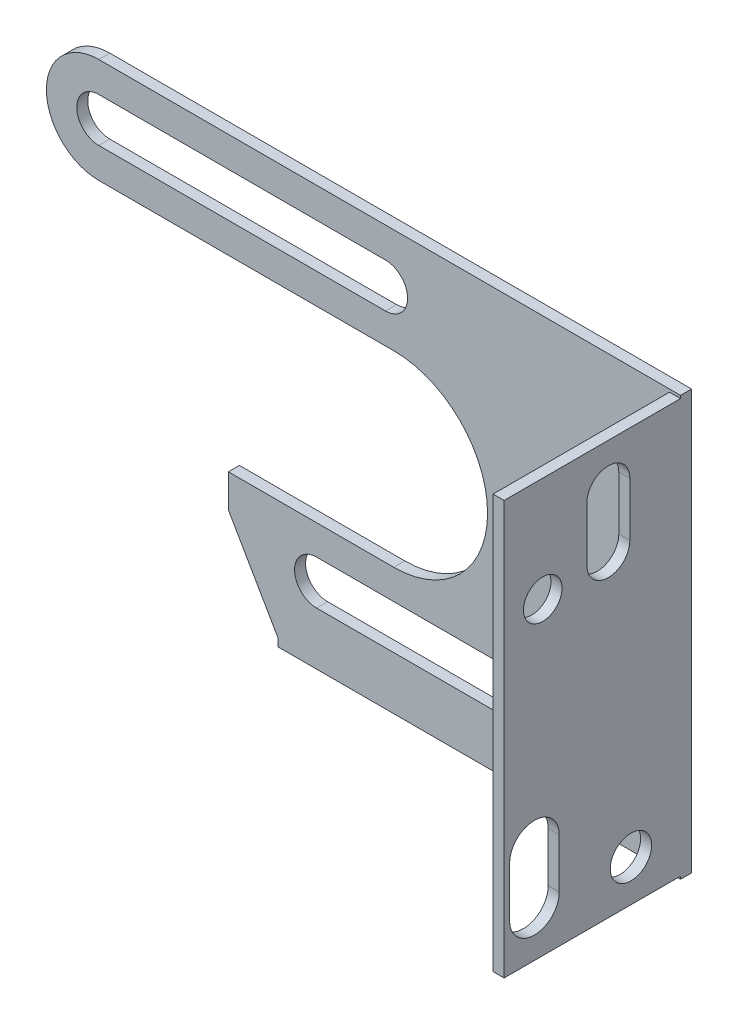
ISO-10303-21;
HEADER;
FILE_DESCRIPTION(('STEP AP214'),'2;1');
FILE_NAME('part.step','',(''),(''),'','','');
FILE_SCHEMA(('AUTOMOTIVE_DESIGN { 1 0 10303 214 1 1 1 1 }'));
ENDSEC;
DATA;
#1=APPLICATION_CONTEXT('core data for automotive mechanical design processes');
#2=APPLICATION_PROTOCOL_DEFINITION('international standard','automotive_design',2000,#1);
#3=PRODUCT_CONTEXT('',#1,'mechanical');
#4=PRODUCT('Part','Part','',(#3));
#5=PRODUCT_RELATED_PRODUCT_CATEGORY('part','',(#4));
#6=PRODUCT_DEFINITION_FORMATION('','',#4);
#7=PRODUCT_DEFINITION_CONTEXT('part definition',#1,'design');
#8=PRODUCT_DEFINITION('design','',#6,#7);
#9=PRODUCT_DEFINITION_SHAPE('','',#8);
#10=(LENGTH_UNIT() NAMED_UNIT(*) SI_UNIT(.MILLI.,.METRE.));
#11=(NAMED_UNIT(*) PLANE_ANGLE_UNIT() SI_UNIT($,.RADIAN.));
#12=(NAMED_UNIT(*) SI_UNIT($,.STERADIAN.) SOLID_ANGLE_UNIT());
#13=UNCERTAINTY_MEASURE_WITH_UNIT(LENGTH_MEASURE(1.E-05),#10,'distance_accuracy_value','');
#14=(GEOMETRIC_REPRESENTATION_CONTEXT(3) GLOBAL_UNCERTAINTY_ASSIGNED_CONTEXT((#13)) GLOBAL_UNIT_ASSIGNED_CONTEXT((#10,
#11,#12)) REPRESENTATION_CONTEXT('',''));
#15=CARTESIAN_POINT('',(0.,0.,0.));
#16=DIRECTION('',(0.,0.,1.));
#17=DIRECTION('',(1.,0.,0.));
#18=AXIS2_PLACEMENT_3D('',#15,#16,#17);
#19=CARTESIAN_POINT('',(0.,-101.6,2.54));
#20=DIRECTION('',(0.,1.,0.));
#21=DIRECTION('',(0.,0.,1.));
#22=AXIS2_PLACEMENT_3D('',#19,#20,#21);
#23=PLANE('',#22);
#24=DIRECTION('',(0.,0.,-1.));
#25=VECTOR('',#24,1.);
#26=CARTESIAN_POINT('',(53.34,-101.6,2.54));
#27=LINE('',#26,#25);
#28=CARTESIAN_POINT('',(53.34,-101.6,2.54));
#29=VERTEX_POINT('',#28);
#30=CARTESIAN_POINT('',(53.34,-101.6,0.));
#31=VERTEX_POINT('',#30);
#32=EDGE_CURVE('E382',#29,#31,#27,.T.);
#33=ORIENTED_EDGE('',*,*,#32,.T.);
#34=DIRECTION('',(1.,0.,0.));
#35=VECTOR('',#34,1.);
#36=CARTESIAN_POINT('',(0.,-101.6,0.));
#37=LINE('',#36,#35);
#38=CARTESIAN_POINT('',(146.05,-101.6,0.));
#39=VERTEX_POINT('',#38);
#40=EDGE_CURVE('E463',#31,#39,#37,.T.);
#41=ORIENTED_EDGE('',*,*,#40,.T.);
#42=DIRECTION('',(0.,0.,-1.));
#43=VECTOR('',#42,1.);
#44=CARTESIAN_POINT('',(146.05,-101.6,2.54));
#45=LINE('',#44,#43);
#46=CARTESIAN_POINT('',(146.05,-101.6,2.54));
#47=VERTEX_POINT('',#46);
#48=EDGE_CURVE('E47',#47,#39,#45,.T.);
#49=ORIENTED_EDGE('',*,*,#48,.F.);
#50=DIRECTION('',(1.,0.,0.));
#51=VECTOR('',#50,1.);
#52=CARTESIAN_POINT('',(0.,-101.6,2.54));
#53=LINE('',#52,#51);
#54=EDGE_CURVE('E464',#29,#47,#53,.T.);
#55=ORIENTED_EDGE('',*,*,#54,.F.);
#56=EDGE_LOOP('',(#33,#41,#49,#55));
#57=FACE_BOUND('',#56,.T.);
#58=ADVANCED_FACE('F40',(#57),#23,.F.);
#59=CARTESIAN_POINT('',(146.05,0.,2.54));
#60=DIRECTION('',(-1.,0.,0.));
#61=DIRECTION('',(0.,0.,1.));
#62=AXIS2_PLACEMENT_3D('',#59,#60,#61);
#63=PLANE('',#62);
#64=DIRECTION('',(0.,0.,-1.));
#65=VECTOR('',#64,1.);
#66=CARTESIAN_POINT('',(146.05,-5.08000000000001,2.54));
#67=LINE('',#66,#65);
#68=CARTESIAN_POINT('',(146.05,-5.08000000000001,2.54));
#69=VERTEX_POINT('',#68);
#70=CARTESIAN_POINT('',(146.05,-5.08000000000001,0.));
#71=VERTEX_POINT('',#70);
#72=EDGE_CURVE('E380',#69,#71,#67,.T.);
#73=ORIENTED_EDGE('',*,*,#72,.F.);
#74=DIRECTION('',(0.,1.,0.));
#75=VECTOR('',#74,1.);
#76=CARTESIAN_POINT('',(146.05,0.,2.54));
#77=LINE('',#76,#75);
#78=CARTESIAN_POINT('',(146.05,-5.715,2.54));
#79=VERTEX_POINT('',#78);
#80=EDGE_CURVE('E466',#79,#69,#77,.T.);
#81=ORIENTED_EDGE('',*,*,#80,.F.);
#82=DIRECTION('',(0.,0.,-1.));
#83=VECTOR('',#82,1.);
#84=CARTESIAN_POINT('',(146.05,-5.715,2.54));
#85=LINE('',#84,#83);
#86=CARTESIAN_POINT('',(146.05,-5.715,43.18));
#87=VERTEX_POINT('',#86);
#88=EDGE_CURVE('E54',#87,#79,#85,.T.);
#89=ORIENTED_EDGE('',*,*,#88,.F.);
#90=DIRECTION('',(0.,1.,0.));
#91=VECTOR('',#90,1.);
#92=CARTESIAN_POINT('',(146.05,-5.715,43.18));
#93=LINE('',#92,#91);
#94=CARTESIAN_POINT('',(146.05,-100.965,43.18));
#95=VERTEX_POINT('',#94);
#96=EDGE_CURVE('E331',#95,#87,#93,.T.);
#97=ORIENTED_EDGE('',*,*,#96,.F.);
#98=DIRECTION('',(0.,0.,1.));
#99=VECTOR('',#98,1.);
#100=CARTESIAN_POINT('',(146.05,-100.965,43.18));
#101=LINE('',#100,#99);
#102=CARTESIAN_POINT('',(146.05,-100.965,2.54));
#103=VERTEX_POINT('',#102);
#104=EDGE_CURVE('E319',#103,#95,#101,.T.);
#105=ORIENTED_EDGE('',*,*,#104,.F.);
#106=EDGE_CURVE('E468',#47,#103,#77,.T.);
#107=ORIENTED_EDGE('',*,*,#106,.F.);
#108=ORIENTED_EDGE('',*,*,#48,.T.);
#109=DIRECTION('',(0.,1.,0.));
#110=VECTOR('',#109,1.);
#111=CARTESIAN_POINT('',(146.05,0.,0.));
#112=LINE('',#111,#110);
#113=EDGE_CURVE('E467',#39,#71,#112,.T.);
#114=ORIENTED_EDGE('',*,*,#113,.T.);
#115=EDGE_LOOP('',(#73,#81,#89,#97,#105,#107,#108,#114));
#116=FACE_BOUND('',#115,.T.);
#117=DIRECTION('',(0.,1.,0.));
#118=VECTOR('',#117,1.);
#119=CARTESIAN_POINT('',(146.05,-78.74,41.91));
#120=LINE('',#119,#118);
#121=CARTESIAN_POINT('',(146.05,-90.1700000000001,41.91));
#122=VERTEX_POINT('',#121);
#123=CARTESIAN_POINT('',(146.05,-78.74,41.91));
#124=VERTEX_POINT('',#123);
#125=EDGE_CURVE('E249',#122,#124,#120,.T.);
#126=ORIENTED_EDGE('',*,*,#125,.T.);
#127=CARTESIAN_POINT('',(146.05,-78.74,36.195));
#128=DIRECTION('',(-1.,0.,0.));
#129=DIRECTION('',(0.,0.,1.));
#130=AXIS2_PLACEMENT_3D('',#127,#128,#129);
#131=CIRCLE('',#130,5.715);
#132=CARTESIAN_POINT('',(146.05,-78.74,30.48));
#133=VERTEX_POINT('',#132);
#134=EDGE_CURVE('E270',#124,#133,#131,.T.);
#135=ORIENTED_EDGE('',*,*,#134,.T.);
#136=DIRECTION('',(0.,-1.,0.));
#137=VECTOR('',#136,1.);
#138=CARTESIAN_POINT('',(146.05,-78.74,30.48));
#139=LINE('',#138,#137);
#140=CARTESIAN_POINT('',(146.05,-90.1700000000001,30.48));
#141=VERTEX_POINT('',#140);
#142=EDGE_CURVE('E255',#133,#141,#139,.T.);
#143=ORIENTED_EDGE('',*,*,#142,.T.);
#144=CARTESIAN_POINT('',(146.05,-90.1700000000001,36.195));
#145=DIRECTION('',(-1.,0.,0.));
#146=DIRECTION('',(0.,0.,1.));
#147=AXIS2_PLACEMENT_3D('',#144,#145,#146);
#148=CIRCLE('',#147,5.715);
#149=EDGE_CURVE('E274',#141,#122,#148,.T.);
#150=ORIENTED_EDGE('',*,*,#149,.T.);
#151=EDGE_LOOP('',(#126,#135,#143,#150));
#152=FACE_BOUND('',#151,.T.);
#153=CARTESIAN_POINT('',(146.05,-29.845,34.29));
#154=DIRECTION('',(-1.,0.,0.));
#155=DIRECTION('',(0.,0.,1.));
#156=AXIS2_PLACEMENT_3D('',#153,#154,#155);
#157=CIRCLE('',#156,4.44499999999999);
#158=CARTESIAN_POINT('',(146.05,-29.845,38.735));
#159=VERTEX_POINT('',#158);
#160=EDGE_CURVE('E256',#159,#159,#157,.T.);
#161=ORIENTED_EDGE('',*,*,#160,.T.);
#162=EDGE_LOOP('',(#161));
#163=FACE_BOUND('',#162,.T.);
#164=DIRECTION('',(0.,1.,0.));
#165=VECTOR('',#164,1.);
#166=CARTESIAN_POINT('',(146.05,-15.748,24.13));
#167=LINE('',#166,#165);
#168=CARTESIAN_POINT('',(146.05,-28.1559,24.13));
#169=VERTEX_POINT('',#168);
#170=CARTESIAN_POINT('',(146.05,-15.748,24.13));
#171=VERTEX_POINT('',#170);
#172=EDGE_CURVE('E292',#169,#171,#167,.T.);
#173=ORIENTED_EDGE('',*,*,#172,.T.);
#174=CARTESIAN_POINT('',(146.05,-15.748,19.177));
#175=DIRECTION('',(-1.,0.,0.));
#176=DIRECTION('',(0.,0.,1.));
#177=AXIS2_PLACEMENT_3D('',#174,#175,#176);
#178=CIRCLE('',#177,4.953);
#179=CARTESIAN_POINT('',(146.05,-15.748,14.224));
#180=VERTEX_POINT('',#179);
#181=EDGE_CURVE('E286',#171,#180,#178,.T.);
#182=ORIENTED_EDGE('',*,*,#181,.T.);
#183=DIRECTION('',(0.,-1.,0.));
#184=VECTOR('',#183,1.);
#185=CARTESIAN_POINT('',(146.05,-15.748,14.224));
#186=LINE('',#185,#184);
#187=CARTESIAN_POINT('',(146.05,-28.1559,14.224));
#188=VERTEX_POINT('',#187);
#189=EDGE_CURVE('E302',#180,#188,#186,.T.);
#190=ORIENTED_EDGE('',*,*,#189,.T.);
#191=CARTESIAN_POINT('',(146.05,-28.1559,19.177));
#192=DIRECTION('',(-1.,0.,0.));
#193=DIRECTION('',(0.,0.,1.));
#194=AXIS2_PLACEMENT_3D('',#191,#192,#193);
#195=CIRCLE('',#194,4.953);
#196=EDGE_CURVE('E305',#188,#169,#195,.T.);
#197=ORIENTED_EDGE('',*,*,#196,.T.);
#198=EDGE_LOOP('',(#173,#182,#190,#197));
#199=FACE_BOUND('',#198,.T.);
#200=CARTESIAN_POINT('',(146.05,-91.44,13.97));
#201=DIRECTION('',(-1.,0.,0.));
#202=DIRECTION('',(0.,0.,1.));
#203=AXIS2_PLACEMENT_3D('',#200,#201,#202);
#204=CIRCLE('',#203,4.7625);
#205=CARTESIAN_POINT('',(146.05,-91.44,18.7325));
#206=VERTEX_POINT('',#205);
#207=EDGE_CURVE('E655',#206,#206,#204,.T.);
#208=ORIENTED_EDGE('',*,*,#207,.T.);
#209=EDGE_LOOP('',(#208));
#210=FACE_BOUND('',#209,.T.);
#211=ADVANCED_FACE('F479',(#116,#152,#163,#199,#210),#63,.F.);
#212=CARTESIAN_POINT('',(0.,0.,2.54));
#213=DIRECTION('',(0.,0.,1.));
#214=DIRECTION('',(1.,0.,0.));
#215=AXIS2_PLACEMENT_3D('',#212,#213,#214);
#216=PLANE('',#215);
#217=DIRECTION('',(1.,0.,0.));
#218=VECTOR('',#217,1.);
#219=CARTESIAN_POINT('',(143.51,-100.965,2.54));
#220=LINE('',#219,#218);
#221=CARTESIAN_POINT('',(143.51,-100.965,2.54));
#222=VERTEX_POINT('',#221);
#223=EDGE_CURVE('E340',#222,#103,#220,.T.);
#224=ORIENTED_EDGE('',*,*,#223,.F.);
#225=DIRECTION('',(0.,-1.,0.));
#226=VECTOR('',#225,1.);
#227=CARTESIAN_POINT('',(143.51,-100.965,2.54));
#228=LINE('',#227,#226);
#229=CARTESIAN_POINT('',(143.51,-5.715,2.54));
#230=VERTEX_POINT('',#229);
#231=EDGE_CURVE('E320',#230,#222,#228,.T.);
#232=ORIENTED_EDGE('',*,*,#231,.F.);
#233=DIRECTION('',(1.,0.,0.));
#234=VECTOR('',#233,1.);
#235=CARTESIAN_POINT('',(143.51,-5.715,2.54));
#236=LINE('',#235,#234);
#237=EDGE_CURVE('E329',#230,#79,#236,.T.);
#238=ORIENTED_EDGE('',*,*,#237,.T.);
#239=ORIENTED_EDGE('',*,*,#80,.T.);
#240=DIRECTION('',(1.,0.,0.));
#241=VECTOR('',#240,1.);
#242=CARTESIAN_POINT('',(146.05,-5.08000000000001,2.54));
#243=LINE('',#242,#241);
#244=CARTESIAN_POINT('',(12.065,-5.08,2.54));
#245=VERTEX_POINT('',#244);
#246=EDGE_CURVE('E425',#245,#69,#243,.T.);
#247=ORIENTED_EDGE('',*,*,#246,.F.);
#248=CARTESIAN_POINT('',(12.065,-17.145,2.54));
#249=DIRECTION('',(0.,0.,-1.));
#250=DIRECTION('',(-1.,0.,0.));
#251=AXIS2_PLACEMENT_3D('',#248,#249,#250);
#252=CIRCLE('',#251,12.065);
#253=CARTESIAN_POINT('',(12.065,-29.21,2.54));
#254=VERTEX_POINT('',#253);
#255=EDGE_CURVE('E428',#254,#245,#252,.T.);
#256=ORIENTED_EDGE('',*,*,#255,.F.);
#257=DIRECTION('',(-1.,0.,0.));
#258=VECTOR('',#257,1.);
#259=CARTESIAN_POINT('',(80.01,-29.21,2.54));
#260=LINE('',#259,#258);
#261=CARTESIAN_POINT('',(80.01,-29.21,2.54));
#262=VERTEX_POINT('',#261);
#263=EDGE_CURVE('E430',#262,#254,#260,.T.);
#264=ORIENTED_EDGE('',*,*,#263,.F.);
#265=CARTESIAN_POINT('',(80.01,-50.8,2.54));
#266=DIRECTION('',(0.,0.,1.));
#267=DIRECTION('',(-1.,0.,0.));
#268=AXIS2_PLACEMENT_3D('',#265,#266,#267);
#269=CIRCLE('',#268,21.59);
#270=CARTESIAN_POINT('',(80.01,-72.39,2.54));
#271=VERTEX_POINT('',#270);
#272=EDGE_CURVE('E399',#271,#262,#269,.T.);
#273=ORIENTED_EDGE('',*,*,#272,.F.);
#274=DIRECTION('',(1.,0.,0.));
#275=VECTOR('',#274,1.);
#276=CARTESIAN_POINT('',(80.01,-72.39,2.54));
#277=LINE('',#276,#275);
#278=CARTESIAN_POINT('',(41.91,-72.39,2.54));
#279=VERTEX_POINT('',#278);
#280=EDGE_CURVE('E394',#279,#271,#277,.T.);
#281=ORIENTED_EDGE('',*,*,#280,.F.);
#282=DIRECTION('',(0.,1.,0.));
#283=VECTOR('',#282,1.);
#284=CARTESIAN_POINT('',(41.91,-72.39,2.54));
#285=LINE('',#284,#283);
#286=CARTESIAN_POINT('',(41.91,-80.01,2.54));
#287=VERTEX_POINT('',#286);
#288=EDGE_CURVE('E419',#287,#279,#285,.T.);
#289=ORIENTED_EDGE('',*,*,#288,.F.);
#290=DIRECTION('',(-0.500000000000002,0.866025403784438,0.));
#291=VECTOR('',#290,1.);
#292=CARTESIAN_POINT('',(41.91,-80.01,2.54));
#293=LINE('',#292,#291);
#294=CARTESIAN_POINT('',(53.34,-99.8073407305123,2.54));
#295=VERTEX_POINT('',#294);
#296=EDGE_CURVE('E421',#295,#287,#293,.T.);
#297=ORIENTED_EDGE('',*,*,#296,.F.);
#298=DIRECTION('',(0.,1.,0.));
#299=VECTOR('',#298,1.);
#300=CARTESIAN_POINT('',(53.34,-99.8073407305123,2.54));
#301=LINE('',#300,#299);
#302=EDGE_CURVE('E423',#29,#295,#301,.T.);
#303=ORIENTED_EDGE('',*,*,#302,.F.);
#304=ORIENTED_EDGE('',*,*,#54,.T.);
#305=ORIENTED_EDGE('',*,*,#106,.T.);
#306=EDGE_LOOP('',(#224,#232,#238,#239,#247,#256,#264,#273,#281,#289,#297,#303,#304,#305));
#307=FACE_BOUND('',#306,.T.);
#308=DIRECTION('',(1.,0.,0.));
#309=VECTOR('',#308,1.);
#310=CARTESIAN_POINT('',(12.065,-22.225,2.54));
#311=LINE('',#310,#309);
#312=CARTESIAN_POINT('',(12.065,-22.225,2.54));
#313=VERTEX_POINT('',#312);
#314=CARTESIAN_POINT('',(78.105,-22.225,2.54));
#315=VERTEX_POINT('',#314);
#316=EDGE_CURVE('E435',#313,#315,#311,.T.);
#317=ORIENTED_EDGE('',*,*,#316,.F.);
#318=CARTESIAN_POINT('',(12.065,-17.145,2.54));
#319=DIRECTION('',(0.,0.,1.));
#320=DIRECTION('',(1.,0.,0.));
#321=AXIS2_PLACEMENT_3D('',#318,#319,#320);
#322=CIRCLE('',#321,5.08000000000001);
#323=CARTESIAN_POINT('',(12.065,-12.065,2.54));
#324=VERTEX_POINT('',#323);
#325=EDGE_CURVE('E433',#324,#313,#322,.T.);
#326=ORIENTED_EDGE('',*,*,#325,.F.);
#327=DIRECTION('',(-1.,0.,0.));
#328=VECTOR('',#327,1.);
#329=CARTESIAN_POINT('',(12.065,-12.065,2.54));
#330=LINE('',#329,#328);
#331=CARTESIAN_POINT('',(78.105,-12.065,2.54));
#332=VERTEX_POINT('',#331);
#333=EDGE_CURVE('E441',#332,#324,#330,.T.);
#334=ORIENTED_EDGE('',*,*,#333,.F.);
#335=CARTESIAN_POINT('',(78.105,-17.145,2.54));
#336=DIRECTION('',(0.,0.,1.));
#337=DIRECTION('',(1.,0.,0.));
#338=AXIS2_PLACEMENT_3D('',#335,#336,#337);
#339=CIRCLE('',#338,5.08);
#340=EDGE_CURVE('E438',#315,#332,#339,.T.);
#341=ORIENTED_EDGE('',*,*,#340,.F.);
#342=EDGE_LOOP('',(#317,#326,#334,#341));
#343=FACE_BOUND('',#342,.T.);
#344=DIRECTION('',(1.,0.,0.));
#345=VECTOR('',#344,1.);
#346=CARTESIAN_POINT('',(62.23,-89.408,2.54));
#347=LINE('',#346,#345);
#348=CARTESIAN_POINT('',(62.23,-89.408,2.54));
#349=VERTEX_POINT('',#348);
#350=CARTESIAN_POINT('',(128.27,-89.408,2.54));
#351=VERTEX_POINT('',#350);
#352=EDGE_CURVE('E370',#349,#351,#347,.T.);
#353=ORIENTED_EDGE('',*,*,#352,.F.);
#354=CARTESIAN_POINT('',(62.23,-84.328,2.54));
#355=DIRECTION('',(0.,0.,1.));
#356=DIRECTION('',(1.,0.,0.));
#357=AXIS2_PLACEMENT_3D('',#354,#355,#356);
#358=CIRCLE('',#357,5.08000000000002);
#359=CARTESIAN_POINT('',(62.23,-79.248,2.54));
#360=VERTEX_POINT('',#359);
#361=EDGE_CURVE('E357',#360,#349,#358,.T.);
#362=ORIENTED_EDGE('',*,*,#361,.F.);
#363=DIRECTION('',(-1.,0.,0.));
#364=VECTOR('',#363,1.);
#365=CARTESIAN_POINT('',(62.23,-79.248,2.54));
#366=LINE('',#365,#364);
#367=CARTESIAN_POINT('',(128.27,-79.248,2.54));
#368=VERTEX_POINT('',#367);
#369=EDGE_CURVE('E352',#368,#360,#366,.T.);
#370=ORIENTED_EDGE('',*,*,#369,.F.);
#371=CARTESIAN_POINT('',(128.27,-84.328,2.54));
#372=DIRECTION('',(0.,0.,1.));
#373=DIRECTION('',(1.,0.,0.));
#374=AXIS2_PLACEMENT_3D('',#371,#372,#373);
#375=CIRCLE('',#374,5.08);
#376=EDGE_CURVE('E368',#351,#368,#375,.T.);
#377=ORIENTED_EDGE('',*,*,#376,.F.);
#378=EDGE_LOOP('',(#353,#362,#370,#377));
#379=FACE_BOUND('',#378,.T.);
#380=ADVANCED_FACE('F496',(#307,#343,#379),#216,.T.);
#381=CARTESIAN_POINT('',(0.,0.,0.));
#382=DIRECTION('',(0.,0.,1.));
#383=DIRECTION('',(1.,0.,0.));
#384=AXIS2_PLACEMENT_3D('',#381,#382,#383);
#385=PLANE('',#384);
#386=CARTESIAN_POINT('',(12.065,-17.145,0.));
#387=DIRECTION('',(0.,0.,1.));
#388=DIRECTION('',(1.,0.,0.));
#389=AXIS2_PLACEMENT_3D('',#386,#387,#388);
#390=CIRCLE('',#389,5.08000000000001);
#391=CARTESIAN_POINT('',(12.065,-12.065,0.));
#392=VERTEX_POINT('',#391);
#393=CARTESIAN_POINT('',(12.065,-22.225,0.));
#394=VERTEX_POINT('',#393);
#395=EDGE_CURVE('E417',#392,#394,#390,.T.);
#396=ORIENTED_EDGE('',*,*,#395,.T.);
#397=DIRECTION('',(1.,0.,0.));
#398=VECTOR('',#397,1.);
#399=CARTESIAN_POINT('',(12.065,-22.225,0.));
#400=LINE('',#399,#398);
#401=CARTESIAN_POINT('',(78.105,-22.225,0.));
#402=VERTEX_POINT('',#401);
#403=EDGE_CURVE('E446',#394,#402,#400,.T.);
#404=ORIENTED_EDGE('',*,*,#403,.T.);
#405=CARTESIAN_POINT('',(78.105,-17.145,0.));
#406=DIRECTION('',(0.,0.,1.));
#407=DIRECTION('',(1.,0.,0.));
#408=AXIS2_PLACEMENT_3D('',#405,#406,#407);
#409=CIRCLE('',#408,5.08);
#410=CARTESIAN_POINT('',(78.105,-12.065,0.));
#411=VERTEX_POINT('',#410);
#412=EDGE_CURVE('E449',#402,#411,#409,.T.);
#413=ORIENTED_EDGE('',*,*,#412,.T.);
#414=DIRECTION('',(-1.,0.,0.));
#415=VECTOR('',#414,1.);
#416=CARTESIAN_POINT('',(12.065,-12.065,0.));
#417=LINE('',#416,#415);
#418=EDGE_CURVE('E436',#411,#392,#417,.T.);
#419=ORIENTED_EDGE('',*,*,#418,.T.);
#420=EDGE_LOOP('',(#396,#404,#413,#419));
#421=FACE_BOUND('',#420,.T.);
#422=CARTESIAN_POINT('',(62.23,-84.328,0.));
#423=DIRECTION('',(0.,0.,1.));
#424=DIRECTION('',(1.,0.,0.));
#425=AXIS2_PLACEMENT_3D('',#422,#423,#424);
#426=CIRCLE('',#425,5.08000000000002);
#427=CARTESIAN_POINT('',(62.23,-79.248,0.));
#428=VERTEX_POINT('',#427);
#429=CARTESIAN_POINT('',(62.23,-89.408,0.));
#430=VERTEX_POINT('',#429);
#431=EDGE_CURVE('E363',#428,#430,#426,.T.);
#432=ORIENTED_EDGE('',*,*,#431,.T.);
#433=DIRECTION('',(1.,0.,0.));
#434=VECTOR('',#433,1.);
#435=CARTESIAN_POINT('',(62.23,-89.408,0.));
#436=LINE('',#435,#434);
#437=CARTESIAN_POINT('',(128.27,-89.408,0.));
#438=VERTEX_POINT('',#437);
#439=EDGE_CURVE('E360',#430,#438,#436,.T.);
#440=ORIENTED_EDGE('',*,*,#439,.T.);
#441=CARTESIAN_POINT('',(128.27,-84.328,0.));
#442=DIRECTION('',(0.,0.,1.));
#443=DIRECTION('',(1.,0.,0.));
#444=AXIS2_PLACEMENT_3D('',#441,#442,#443);
#445=CIRCLE('',#444,5.08);
#446=CARTESIAN_POINT('',(128.27,-79.248,0.));
#447=VERTEX_POINT('',#446);
#448=EDGE_CURVE('E356',#438,#447,#445,.T.);
#449=ORIENTED_EDGE('',*,*,#448,.T.);
#450=DIRECTION('',(-1.,0.,0.));
#451=VECTOR('',#450,1.);
#452=CARTESIAN_POINT('',(62.23,-79.248,0.));
#453=LINE('',#452,#451);
#454=EDGE_CURVE('E353',#447,#428,#453,.T.);
#455=ORIENTED_EDGE('',*,*,#454,.T.);
#456=EDGE_LOOP('',(#432,#440,#449,#455));
#457=FACE_BOUND('',#456,.T.);
#458=DIRECTION('',(1.,0.,0.));
#459=VECTOR('',#458,1.);
#460=CARTESIAN_POINT('',(146.05,-5.08000000000001,0.));
#461=LINE('',#460,#459);
#462=CARTESIAN_POINT('',(12.065,-5.08,0.));
#463=VERTEX_POINT('',#462);
#464=EDGE_CURVE('E408',#463,#71,#461,.T.);
#465=ORIENTED_EDGE('',*,*,#464,.T.);
#466=ORIENTED_EDGE('',*,*,#113,.F.);
#467=ORIENTED_EDGE('',*,*,#40,.F.);
#468=DIRECTION('',(0.,1.,0.));
#469=VECTOR('',#468,1.);
#470=CARTESIAN_POINT('',(53.34,-99.8073407305123,0.));
#471=LINE('',#470,#469);
#472=CARTESIAN_POINT('',(53.34,-99.8073407305123,0.));
#473=VERTEX_POINT('',#472);
#474=EDGE_CURVE('E405',#31,#473,#471,.T.);
#475=ORIENTED_EDGE('',*,*,#474,.T.);
#476=DIRECTION('',(-0.500000000000002,0.866025403784438,0.));
#477=VECTOR('',#476,1.);
#478=CARTESIAN_POINT('',(41.91,-80.01,0.));
#479=LINE('',#478,#477);
#480=CARTESIAN_POINT('',(41.91,-80.01,0.));
#481=VERTEX_POINT('',#480);
#482=EDGE_CURVE('E402',#473,#481,#479,.T.);
#483=ORIENTED_EDGE('',*,*,#482,.T.);
#484=DIRECTION('',(0.,1.,0.));
#485=VECTOR('',#484,1.);
#486=CARTESIAN_POINT('',(41.91,-72.39,0.));
#487=LINE('',#486,#485);
#488=CARTESIAN_POINT('',(41.91,-72.39,0.));
#489=VERTEX_POINT('',#488);
#490=EDGE_CURVE('E398',#481,#489,#487,.T.);
#491=ORIENTED_EDGE('',*,*,#490,.T.);
#492=DIRECTION('',(1.,0.,0.));
#493=VECTOR('',#492,1.);
#494=CARTESIAN_POINT('',(80.01,-72.39,0.));
#495=LINE('',#494,#493);
#496=CARTESIAN_POINT('',(80.01,-72.39,0.));
#497=VERTEX_POINT('',#496);
#498=EDGE_CURVE('E395',#489,#497,#495,.T.);
#499=ORIENTED_EDGE('',*,*,#498,.T.);
#500=CARTESIAN_POINT('',(80.01,-50.8,0.));
#501=DIRECTION('',(0.,0.,1.));
#502=DIRECTION('',(-1.,0.,0.));
#503=AXIS2_PLACEMENT_3D('',#500,#501,#502);
#504=CIRCLE('',#503,21.59);
#505=CARTESIAN_POINT('',(80.01,-29.21,0.));
#506=VERTEX_POINT('',#505);
#507=EDGE_CURVE('E414',#497,#506,#504,.T.);
#508=ORIENTED_EDGE('',*,*,#507,.T.);
#509=DIRECTION('',(-1.,0.,0.));
#510=VECTOR('',#509,1.);
#511=CARTESIAN_POINT('',(80.01,-29.21,0.));
#512=LINE('',#511,#510);
#513=CARTESIAN_POINT('',(12.065,-29.21,0.));
#514=VERTEX_POINT('',#513);
#515=EDGE_CURVE('E411',#506,#514,#512,.T.);
#516=ORIENTED_EDGE('',*,*,#515,.T.);
#517=CARTESIAN_POINT('',(12.065,-17.145,0.));
#518=DIRECTION('',(0.,0.,1.));
#519=DIRECTION('',(1.,0.,0.));
#520=AXIS2_PLACEMENT_3D('',#517,#518,#519);
#521=CIRCLE('',#520,12.065);
#522=EDGE_CURVE('E11',#463,#514,#521,.T.);
#523=ORIENTED_EDGE('',*,*,#522,.F.);
#524=EDGE_LOOP('',(#465,#466,#467,#475,#483,#491,#499,#508,#516,#523));
#525=FACE_BOUND('',#524,.T.);
#526=ADVANCED_FACE('F485',(#421,#457,#525),#385,.F.);
#527=CARTESIAN_POINT('',(12.065,-17.145,2.54));
#528=DIRECTION('',(0.,0.,-1.));
#529=DIRECTION('',(-1.,0.,0.));
#530=AXIS2_PLACEMENT_3D('',#527,#528,#529);
#531=CYLINDRICAL_SURFACE('',#530,5.08000000000001);
#532=ORIENTED_EDGE('',*,*,#395,.F.);
#533=DIRECTION('',(0.,0.,-1.));
#534=VECTOR('',#533,1.);
#535=CARTESIAN_POINT('',(12.065,-12.065,2.54));
#536=LINE('',#535,#534);
#537=EDGE_CURVE('E443',#324,#392,#536,.T.);
#538=ORIENTED_EDGE('',*,*,#537,.F.);
#539=ORIENTED_EDGE('',*,*,#325,.T.);
#540=DIRECTION('',(0.,0.,-1.));
#541=VECTOR('',#540,1.);
#542=CARTESIAN_POINT('',(12.065,-22.225,2.54));
#543=LINE('',#542,#541);
#544=EDGE_CURVE('E460',#313,#394,#543,.T.);
#545=ORIENTED_EDGE('',*,*,#544,.T.);
#546=EDGE_LOOP('',(#532,#538,#539,#545));
#547=FACE_BOUND('',#546,.T.);
#548=ADVANCED_FACE('F561',(#547),#531,.F.);
#549=CARTESIAN_POINT('',(12.065,-22.225,2.54));
#550=DIRECTION('',(0.,1.,0.));
#551=DIRECTION('',(-1.,0.,0.));
#552=AXIS2_PLACEMENT_3D('',#549,#550,#551);
#553=PLANE('',#552);
#554=ORIENTED_EDGE('',*,*,#403,.F.);
#555=ORIENTED_EDGE('',*,*,#544,.F.);
#556=ORIENTED_EDGE('',*,*,#316,.T.);
#557=DIRECTION('',(0.,0.,-1.));
#558=VECTOR('',#557,1.);
#559=CARTESIAN_POINT('',(78.105,-22.225,2.54));
#560=LINE('',#559,#558);
#561=EDGE_CURVE('E458',#315,#402,#560,.T.);
#562=ORIENTED_EDGE('',*,*,#561,.T.);
#563=EDGE_LOOP('',(#554,#555,#556,#562));
#564=FACE_BOUND('',#563,.T.);
#565=ADVANCED_FACE('F566',(#564),#553,.T.);
#566=CARTESIAN_POINT('',(78.105,-17.145,2.54));
#567=DIRECTION('',(0.,0.,-1.));
#568=DIRECTION('',(-1.,0.,0.));
#569=AXIS2_PLACEMENT_3D('',#566,#567,#568);
#570=CYLINDRICAL_SURFACE('',#569,5.08);
#571=ORIENTED_EDGE('',*,*,#412,.F.);
#572=ORIENTED_EDGE('',*,*,#561,.F.);
#573=ORIENTED_EDGE('',*,*,#340,.T.);
#574=DIRECTION('',(0.,0.,-1.));
#575=VECTOR('',#574,1.);
#576=CARTESIAN_POINT('',(78.105,-12.065,2.54));
#577=LINE('',#576,#575);
#578=EDGE_CURVE('E456',#332,#411,#577,.T.);
#579=ORIENTED_EDGE('',*,*,#578,.T.);
#580=EDGE_LOOP('',(#571,#572,#573,#579));
#581=FACE_BOUND('',#580,.T.);
#582=ADVANCED_FACE('F570',(#581),#570,.F.);
#583=CARTESIAN_POINT('',(12.065,-12.065,2.54));
#584=DIRECTION('',(0.,-1.,0.));
#585=DIRECTION('',(1.,0.,0.));
#586=AXIS2_PLACEMENT_3D('',#583,#584,#585);
#587=PLANE('',#586);
#588=ORIENTED_EDGE('',*,*,#418,.F.);
#589=ORIENTED_EDGE('',*,*,#578,.F.);
#590=ORIENTED_EDGE('',*,*,#333,.T.);
#591=ORIENTED_EDGE('',*,*,#537,.T.);
#592=EDGE_LOOP('',(#588,#589,#590,#591));
#593=FACE_BOUND('',#592,.T.);
#594=ADVANCED_FACE('F574',(#593),#587,.T.);
#595=CARTESIAN_POINT('',(62.23,-84.328,2.54));
#596=DIRECTION('',(0.,0.,-1.));
#597=DIRECTION('',(-1.,0.,0.));
#598=AXIS2_PLACEMENT_3D('',#595,#596,#597);
#599=CYLINDRICAL_SURFACE('',#598,5.08000000000002);
#600=ORIENTED_EDGE('',*,*,#431,.F.);
#601=DIRECTION('',(0.,0.,-1.));
#602=VECTOR('',#601,1.);
#603=CARTESIAN_POINT('',(62.23,-79.248,2.54));
#604=LINE('',#603,#602);
#605=EDGE_CURVE('E349',#360,#428,#604,.T.);
#606=ORIENTED_EDGE('',*,*,#605,.F.);
#607=ORIENTED_EDGE('',*,*,#361,.T.);
#608=DIRECTION('',(0.,0.,-1.));
#609=VECTOR('',#608,1.);
#610=CARTESIAN_POINT('',(62.23,-89.408,2.54));
#611=LINE('',#610,#609);
#612=EDGE_CURVE('E343',#349,#430,#611,.T.);
#613=ORIENTED_EDGE('',*,*,#612,.T.);
#614=EDGE_LOOP('',(#600,#606,#607,#613));
#615=FACE_BOUND('',#614,.T.);
#616=ADVANCED_FACE('F578',(#615),#599,.F.);
#617=CARTESIAN_POINT('',(62.23,-89.408,2.54));
#618=DIRECTION('',(0.,1.,0.));
#619=DIRECTION('',(-1.,0.,0.));
#620=AXIS2_PLACEMENT_3D('',#617,#618,#619);
#621=PLANE('',#620);
#622=ORIENTED_EDGE('',*,*,#439,.F.);
#623=ORIENTED_EDGE('',*,*,#612,.F.);
#624=ORIENTED_EDGE('',*,*,#352,.T.);
#625=DIRECTION('',(0.,0.,-1.));
#626=VECTOR('',#625,1.);
#627=CARTESIAN_POINT('',(128.27,-89.408,2.54));
#628=LINE('',#627,#626);
#629=EDGE_CURVE('E346',#351,#438,#628,.T.);
#630=ORIENTED_EDGE('',*,*,#629,.T.);
#631=EDGE_LOOP('',(#622,#623,#624,#630));
#632=FACE_BOUND('',#631,.T.);
#633=ADVANCED_FACE('F596',(#632),#621,.T.);
#634=CARTESIAN_POINT('',(128.27,-84.328,2.54));
#635=DIRECTION('',(0.,0.,-1.));
#636=DIRECTION('',(-1.,0.,0.));
#637=AXIS2_PLACEMENT_3D('',#634,#635,#636);
#638=CYLINDRICAL_SURFACE('',#637,5.08);
#639=ORIENTED_EDGE('',*,*,#448,.F.);
#640=ORIENTED_EDGE('',*,*,#629,.F.);
#641=ORIENTED_EDGE('',*,*,#376,.T.);
#642=DIRECTION('',(0.,0.,-1.));
#643=VECTOR('',#642,1.);
#644=CARTESIAN_POINT('',(128.27,-79.248,2.54));
#645=LINE('',#644,#643);
#646=EDGE_CURVE('E62',#368,#447,#645,.T.);
#647=ORIENTED_EDGE('',*,*,#646,.T.);
#648=EDGE_LOOP('',(#639,#640,#641,#647));
#649=FACE_BOUND('',#648,.T.);
#650=ADVANCED_FACE('F547',(#649),#638,.F.);
#651=CARTESIAN_POINT('',(62.23,-79.248,2.54));
#652=DIRECTION('',(0.,-1.,0.));
#653=DIRECTION('',(1.,0.,0.));
#654=AXIS2_PLACEMENT_3D('',#651,#652,#653);
#655=PLANE('',#654);
#656=ORIENTED_EDGE('',*,*,#454,.F.);
#657=ORIENTED_EDGE('',*,*,#646,.F.);
#658=ORIENTED_EDGE('',*,*,#369,.T.);
#659=ORIENTED_EDGE('',*,*,#605,.T.);
#660=EDGE_LOOP('',(#656,#657,#658,#659));
#661=FACE_BOUND('',#660,.T.);
#662=ADVANCED_FACE('F540',(#661),#655,.T.);
#663=CARTESIAN_POINT('',(12.065,-17.145,2.54));
#664=DIRECTION('',(0.,0.,-1.));
#665=DIRECTION('',(-1.,0.,0.));
#666=AXIS2_PLACEMENT_3D('',#663,#664,#665);
#667=CYLINDRICAL_SURFACE('',#666,12.065);
#668=ORIENTED_EDGE('',*,*,#255,.T.);
#669=DIRECTION('',(0.,0.,-1.));
#670=VECTOR('',#669,1.);
#671=CARTESIAN_POINT('',(12.065,-5.08,2.54));
#672=LINE('',#671,#670);
#673=EDGE_CURVE('E378',#245,#463,#672,.T.);
#674=ORIENTED_EDGE('',*,*,#673,.T.);
#675=ORIENTED_EDGE('',*,*,#522,.T.);
#676=DIRECTION('',(0.,0.,-1.));
#677=VECTOR('',#676,1.);
#678=CARTESIAN_POINT('',(12.065,-29.21,2.54));
#679=LINE('',#678,#677);
#680=EDGE_CURVE('E375',#254,#514,#679,.T.);
#681=ORIENTED_EDGE('',*,*,#680,.F.);
#682=EDGE_LOOP('',(#668,#674,#675,#681));
#683=FACE_BOUND('',#682,.T.);
#684=ADVANCED_FACE('F538',(#683),#667,.T.);
#685=CARTESIAN_POINT('',(80.01,-50.8,2.54));
#686=DIRECTION('',(0.,0.,-1.));
#687=DIRECTION('',(-1.,0.,0.));
#688=AXIS2_PLACEMENT_3D('',#685,#686,#687);
#689=CYLINDRICAL_SURFACE('',#688,21.59);
#690=ORIENTED_EDGE('',*,*,#507,.F.);
#691=DIRECTION('',(0.,0.,-1.));
#692=VECTOR('',#691,1.);
#693=CARTESIAN_POINT('',(80.01,-72.39,2.54));
#694=LINE('',#693,#692);
#695=EDGE_CURVE('E391',#271,#497,#694,.T.);
#696=ORIENTED_EDGE('',*,*,#695,.F.);
#697=ORIENTED_EDGE('',*,*,#272,.T.);
#698=DIRECTION('',(0.,0.,-1.));
#699=VECTOR('',#698,1.);
#700=CARTESIAN_POINT('',(80.01,-29.21,2.54));
#701=LINE('',#700,#699);
#702=EDGE_CURVE('E366',#262,#506,#701,.T.);
#703=ORIENTED_EDGE('',*,*,#702,.T.);
#704=EDGE_LOOP('',(#690,#696,#697,#703));
#705=FACE_BOUND('',#704,.T.);
#706=ADVANCED_FACE('F530',(#705),#689,.F.);
#707=CARTESIAN_POINT('',(80.01,-29.21,2.54));
#708=DIRECTION('',(0.,-1.,0.));
#709=DIRECTION('',(1.,0.,0.));
#710=AXIS2_PLACEMENT_3D('',#707,#708,#709);
#711=PLANE('',#710);
#712=ORIENTED_EDGE('',*,*,#515,.F.);
#713=ORIENTED_EDGE('',*,*,#702,.F.);
#714=ORIENTED_EDGE('',*,*,#263,.T.);
#715=ORIENTED_EDGE('',*,*,#680,.T.);
#716=EDGE_LOOP('',(#712,#713,#714,#715));
#717=FACE_BOUND('',#716,.T.);
#718=ADVANCED_FACE('F535',(#717),#711,.T.);
#719=CARTESIAN_POINT('',(146.05,-5.08000000000001,2.54));
#720=DIRECTION('',(0.,1.,0.));
#721=DIRECTION('',(-1.,0.,0.));
#722=AXIS2_PLACEMENT_3D('',#719,#720,#721);
#723=PLANE('',#722);
#724=ORIENTED_EDGE('',*,*,#464,.F.);
#725=ORIENTED_EDGE('',*,*,#673,.F.);
#726=ORIENTED_EDGE('',*,*,#246,.T.);
#727=ORIENTED_EDGE('',*,*,#72,.T.);
#728=EDGE_LOOP('',(#724,#725,#726,#727));
#729=FACE_BOUND('',#728,.T.);
#730=ADVANCED_FACE('F490',(#729),#723,.T.);
#731=CARTESIAN_POINT('',(53.34,-99.8073407305123,2.54));
#732=DIRECTION('',(-1.,0.,0.));
#733=DIRECTION('',(0.,0.,1.));
#734=AXIS2_PLACEMENT_3D('',#731,#732,#733);
#735=PLANE('',#734);
#736=ORIENTED_EDGE('',*,*,#474,.F.);
#737=ORIENTED_EDGE('',*,*,#32,.F.);
#738=ORIENTED_EDGE('',*,*,#302,.T.);
#739=DIRECTION('',(0.,0.,-1.));
#740=VECTOR('',#739,1.);
#741=CARTESIAN_POINT('',(53.34,-99.8073407305123,2.54));
#742=LINE('',#741,#740);
#743=EDGE_CURVE('E385',#295,#473,#742,.T.);
#744=ORIENTED_EDGE('',*,*,#743,.T.);
#745=EDGE_LOOP('',(#736,#737,#738,#744));
#746=FACE_BOUND('',#745,.T.);
#747=ADVANCED_FACE('F513',(#746),#735,.T.);
#748=CARTESIAN_POINT('',(41.91,-80.01,2.54));
#749=DIRECTION('',(-0.866025403784438,-0.500000000000002,0.));
#750=DIRECTION('',(0.500000000000002,-0.866025403784438,0.));
#751=AXIS2_PLACEMENT_3D('',#748,#749,#750);
#752=PLANE('',#751);
#753=ORIENTED_EDGE('',*,*,#482,.F.);
#754=ORIENTED_EDGE('',*,*,#743,.F.);
#755=ORIENTED_EDGE('',*,*,#296,.T.);
#756=DIRECTION('',(0.,0.,-1.));
#757=VECTOR('',#756,1.);
#758=CARTESIAN_POINT('',(41.91,-80.01,2.54));
#759=LINE('',#758,#757);
#760=EDGE_CURVE('E387',#287,#481,#759,.T.);
#761=ORIENTED_EDGE('',*,*,#760,.T.);
#762=EDGE_LOOP('',(#753,#754,#755,#761));
#763=FACE_BOUND('',#762,.T.);
#764=ADVANCED_FACE('F518',(#763),#752,.T.);
#765=CARTESIAN_POINT('',(41.91,-72.39,2.54));
#766=DIRECTION('',(-1.,0.,0.));
#767=DIRECTION('',(0.,-1.,0.));
#768=AXIS2_PLACEMENT_3D('',#765,#766,#767);
#769=PLANE('',#768);
#770=ORIENTED_EDGE('',*,*,#490,.F.);
#771=ORIENTED_EDGE('',*,*,#760,.F.);
#772=ORIENTED_EDGE('',*,*,#288,.T.);
#773=DIRECTION('',(0.,0.,-1.));
#774=VECTOR('',#773,1.);
#775=CARTESIAN_POINT('',(41.91,-72.39,2.54));
#776=LINE('',#775,#774);
#777=EDGE_CURVE('E389',#279,#489,#776,.T.);
#778=ORIENTED_EDGE('',*,*,#777,.T.);
#779=EDGE_LOOP('',(#770,#771,#772,#778));
#780=FACE_BOUND('',#779,.T.);
#781=ADVANCED_FACE('F522',(#780),#769,.T.);
#782=CARTESIAN_POINT('',(80.01,-72.39,2.54));
#783=DIRECTION('',(0.,1.,0.));
#784=DIRECTION('',(0.,0.,1.));
#785=AXIS2_PLACEMENT_3D('',#782,#783,#784);
#786=PLANE('',#785);
#787=ORIENTED_EDGE('',*,*,#498,.F.);
#788=ORIENTED_EDGE('',*,*,#777,.F.);
#789=ORIENTED_EDGE('',*,*,#280,.T.);
#790=ORIENTED_EDGE('',*,*,#695,.T.);
#791=EDGE_LOOP('',(#787,#788,#789,#790));
#792=FACE_BOUND('',#791,.T.);
#793=ADVANCED_FACE('F527',(#792),#786,.T.);
#794=CARTESIAN_POINT('',(143.51,0.,0.));
#795=DIRECTION('',(1.,0.,0.));
#796=DIRECTION('',(0.,0.,-1.));
#797=AXIS2_PLACEMENT_3D('',#794,#795,#796);
#798=PLANE('',#797);
#799=CARTESIAN_POINT('',(143.51,-29.845,34.29));
#800=DIRECTION('',(-1.,0.,0.));
#801=DIRECTION('',(0.,0.,1.));
#802=AXIS2_PLACEMENT_3D('',#799,#800,#801);
#803=CIRCLE('',#802,4.44499999999999);
#804=CARTESIAN_POINT('',(143.51,-29.845,38.735));
#805=VERTEX_POINT('',#804);
#806=EDGE_CURVE('E283',#805,#805,#803,.T.);
#807=ORIENTED_EDGE('',*,*,#806,.F.);
#808=EDGE_LOOP('',(#807));
#809=FACE_BOUND('',#808,.T.);
#810=CARTESIAN_POINT('',(143.51,-15.748,19.177));
#811=DIRECTION('',(-1.,0.,0.));
#812=DIRECTION('',(0.,0.,1.));
#813=AXIS2_PLACEMENT_3D('',#810,#811,#812);
#814=CIRCLE('',#813,4.953);
#815=CARTESIAN_POINT('',(143.51,-15.748,24.13));
#816=VERTEX_POINT('',#815);
#817=CARTESIAN_POINT('',(143.51,-15.748,14.224));
#818=VERTEX_POINT('',#817);
#819=EDGE_CURVE('E289',#816,#818,#814,.T.);
#820=ORIENTED_EDGE('',*,*,#819,.F.);
#821=DIRECTION('',(0.,1.,0.));
#822=VECTOR('',#821,1.);
#823=CARTESIAN_POINT('',(143.51,-15.748,24.13));
#824=LINE('',#823,#822);
#825=CARTESIAN_POINT('',(143.51,-28.1559,24.13));
#826=VERTEX_POINT('',#825);
#827=EDGE_CURVE('E297',#826,#816,#824,.T.);
#828=ORIENTED_EDGE('',*,*,#827,.F.);
#829=CARTESIAN_POINT('',(143.51,-28.1559,19.177));
#830=DIRECTION('',(-1.,0.,0.));
#831=DIRECTION('',(0.,0.,1.));
#832=AXIS2_PLACEMENT_3D('',#829,#830,#831);
#833=CIRCLE('',#832,4.953);
#834=CARTESIAN_POINT('',(143.51,-28.1559,14.224));
#835=VERTEX_POINT('',#834);
#836=EDGE_CURVE('E294',#835,#826,#833,.T.);
#837=ORIENTED_EDGE('',*,*,#836,.F.);
#838=DIRECTION('',(0.,-1.,0.));
#839=VECTOR('',#838,1.);
#840=CARTESIAN_POINT('',(143.51,-15.748,14.224));
#841=LINE('',#840,#839);
#842=EDGE_CURVE('E291',#818,#835,#841,.T.);
#843=ORIENTED_EDGE('',*,*,#842,.F.);
#844=EDGE_LOOP('',(#820,#828,#837,#843));
#845=FACE_BOUND('',#844,.T.);
#846=ORIENTED_EDGE('',*,*,#231,.T.);
#847=DIRECTION('',(0.,0.,1.));
#848=VECTOR('',#847,1.);
#849=CARTESIAN_POINT('',(143.51,-100.965,43.18));
#850=LINE('',#849,#848);
#851=CARTESIAN_POINT('',(143.51,-100.965,43.18));
#852=VERTEX_POINT('',#851);
#853=EDGE_CURVE('E323',#222,#852,#850,.T.);
#854=ORIENTED_EDGE('',*,*,#853,.T.);
#855=DIRECTION('',(0.,1.,0.));
#856=VECTOR('',#855,1.);
#857=CARTESIAN_POINT('',(143.51,-5.715,43.18));
#858=LINE('',#857,#856);
#859=CARTESIAN_POINT('',(143.51,-5.715,43.18));
#860=VERTEX_POINT('',#859);
#861=EDGE_CURVE('E325',#852,#860,#858,.T.);
#862=ORIENTED_EDGE('',*,*,#861,.T.);
#863=DIRECTION('',(0.,0.,-1.));
#864=VECTOR('',#863,1.);
#865=CARTESIAN_POINT('',(143.51,-5.715,2.54));
#866=LINE('',#865,#864);
#867=EDGE_CURVE('E327',#860,#230,#866,.T.);
#868=ORIENTED_EDGE('',*,*,#867,.T.);
#869=EDGE_LOOP('',(#846,#854,#862,#868));
#870=FACE_BOUND('',#869,.T.);
#871=CARTESIAN_POINT('',(143.51,-78.74,36.195));
#872=DIRECTION('',(-1.,0.,0.));
#873=DIRECTION('',(0.,0.,1.));
#874=AXIS2_PLACEMENT_3D('',#871,#872,#873);
#875=CIRCLE('',#874,5.715);
#876=CARTESIAN_POINT('',(143.51,-78.74,41.91));
#877=VERTEX_POINT('',#876);
#878=CARTESIAN_POINT('',(143.51,-78.74,30.48));
#879=VERTEX_POINT('',#878);
#880=EDGE_CURVE('E238',#877,#879,#875,.T.);
#881=ORIENTED_EDGE('',*,*,#880,.F.);
#882=DIRECTION('',(0.,1.,0.));
#883=VECTOR('',#882,1.);
#884=CARTESIAN_POINT('',(143.51,-78.74,41.91));
#885=LINE('',#884,#883);
#886=CARTESIAN_POINT('',(143.51,-90.1700000000001,41.91));
#887=VERTEX_POINT('',#886);
#888=EDGE_CURVE('E265',#887,#877,#885,.T.);
#889=ORIENTED_EDGE('',*,*,#888,.F.);
#890=CARTESIAN_POINT('',(143.51,-90.1700000000001,36.195));
#891=DIRECTION('',(-1.,0.,0.));
#892=DIRECTION('',(0.,0.,1.));
#893=AXIS2_PLACEMENT_3D('',#890,#891,#892);
#894=CIRCLE('',#893,5.715);
#895=CARTESIAN_POINT('',(143.51,-90.1700000000001,30.48));
#896=VERTEX_POINT('',#895);
#897=EDGE_CURVE('E263',#896,#887,#894,.T.);
#898=ORIENTED_EDGE('',*,*,#897,.F.);
#899=DIRECTION('',(0.,-1.,0.));
#900=VECTOR('',#899,1.);
#901=CARTESIAN_POINT('',(143.51,-78.74,30.48));
#902=LINE('',#901,#900);
#903=EDGE_CURVE('E248',#879,#896,#902,.T.);
#904=ORIENTED_EDGE('',*,*,#903,.F.);
#905=EDGE_LOOP('',(#881,#889,#898,#904));
#906=FACE_BOUND('',#905,.T.);
#907=CARTESIAN_POINT('',(143.51,-91.44,13.97));
#908=DIRECTION('',(-1.,0.,0.));
#909=DIRECTION('',(0.,0.,1.));
#910=AXIS2_PLACEMENT_3D('',#907,#908,#909);
#911=CIRCLE('',#910,4.7625);
#912=CARTESIAN_POINT('',(143.51,-91.44,18.7325));
#913=VERTEX_POINT('',#912);
#914=EDGE_CURVE('E272',#913,#913,#911,.T.);
#915=ORIENTED_EDGE('',*,*,#914,.F.);
#916=EDGE_LOOP('',(#915));
#917=FACE_BOUND('',#916,.T.);
#918=ADVANCED_FACE('F260',(#809,#845,#870,#906,#917),#798,.F.);
#919=CARTESIAN_POINT('',(143.51,-100.965,43.18));
#920=DIRECTION('',(0.,1.,0.));
#921=DIRECTION('',(0.,0.,1.));
#922=AXIS2_PLACEMENT_3D('',#919,#920,#921);
#923=PLANE('',#922);
#924=ORIENTED_EDGE('',*,*,#104,.T.);
#925=DIRECTION('',(1.,0.,0.));
#926=VECTOR('',#925,1.);
#927=CARTESIAN_POINT('',(143.51,-100.965,43.18));
#928=LINE('',#927,#926);
#929=EDGE_CURVE('E337',#852,#95,#928,.T.);
#930=ORIENTED_EDGE('',*,*,#929,.F.);
#931=ORIENTED_EDGE('',*,*,#853,.F.);
#932=ORIENTED_EDGE('',*,*,#223,.T.);
#933=EDGE_LOOP('',(#924,#930,#931,#932));
#934=FACE_BOUND('',#933,.T.);
#935=ADVANCED_FACE('F509',(#934),#923,.F.);
#936=CARTESIAN_POINT('',(143.51,-5.715,43.18));
#937=DIRECTION('',(0.,0.,-1.));
#938=DIRECTION('',(-1.,0.,0.));
#939=AXIS2_PLACEMENT_3D('',#936,#937,#938);
#940=PLANE('',#939);
#941=ORIENTED_EDGE('',*,*,#96,.T.);
#942=DIRECTION('',(1.,0.,0.));
#943=VECTOR('',#942,1.);
#944=CARTESIAN_POINT('',(143.51,-5.715,43.18));
#945=LINE('',#944,#943);
#946=EDGE_CURVE('E335',#860,#87,#945,.T.);
#947=ORIENTED_EDGE('',*,*,#946,.F.);
#948=ORIENTED_EDGE('',*,*,#861,.F.);
#949=ORIENTED_EDGE('',*,*,#929,.T.);
#950=EDGE_LOOP('',(#941,#947,#948,#949));
#951=FACE_BOUND('',#950,.T.);
#952=ADVANCED_FACE('F507',(#951),#940,.F.);
#953=CARTESIAN_POINT('',(143.51,-5.715,2.54));
#954=DIRECTION('',(0.,-1.,0.));
#955=DIRECTION('',(0.,0.,-1.));
#956=AXIS2_PLACEMENT_3D('',#953,#954,#955);
#957=PLANE('',#956);
#958=ORIENTED_EDGE('',*,*,#88,.T.);
#959=ORIENTED_EDGE('',*,*,#237,.F.);
#960=ORIENTED_EDGE('',*,*,#867,.F.);
#961=ORIENTED_EDGE('',*,*,#946,.T.);
#962=EDGE_LOOP('',(#958,#959,#960,#961));
#963=FACE_BOUND('',#962,.T.);
#964=ADVANCED_FACE('F501',(#963),#957,.F.);
#965=CARTESIAN_POINT('',(143.51,-15.748,19.177));
#966=DIRECTION('',(1.,0.,0.));
#967=DIRECTION('',(0.,0.,-1.));
#968=AXIS2_PLACEMENT_3D('',#965,#966,#967);
#969=CYLINDRICAL_SURFACE('',#968,4.953);
#970=ORIENTED_EDGE('',*,*,#181,.F.);
#971=DIRECTION('',(1.,0.,0.));
#972=VECTOR('',#971,1.);
#973=CARTESIAN_POINT('',(143.51,-15.748,24.13));
#974=LINE('',#973,#972);
#975=EDGE_CURVE('E299',#816,#171,#974,.T.);
#976=ORIENTED_EDGE('',*,*,#975,.F.);
#977=ORIENTED_EDGE('',*,*,#819,.T.);
#978=DIRECTION('',(1.,0.,0.));
#979=VECTOR('',#978,1.);
#980=CARTESIAN_POINT('',(143.51,-15.748,14.224));
#981=LINE('',#980,#979);
#982=EDGE_CURVE('E316',#818,#180,#981,.T.);
#983=ORIENTED_EDGE('',*,*,#982,.T.);
#984=EDGE_LOOP('',(#970,#976,#977,#983));
#985=FACE_BOUND('',#984,.T.);
#986=ADVANCED_FACE('F610',(#985),#969,.F.);
#987=CARTESIAN_POINT('',(143.51,-15.748,14.224));
#988=DIRECTION('',(0.,0.,1.));
#989=DIRECTION('',(0.,-1.,0.));
#990=AXIS2_PLACEMENT_3D('',#987,#988,#989);
#991=PLANE('',#990);
#992=ORIENTED_EDGE('',*,*,#189,.F.);
#993=ORIENTED_EDGE('',*,*,#982,.F.);
#994=ORIENTED_EDGE('',*,*,#842,.T.);
#995=DIRECTION('',(1.,0.,0.));
#996=VECTOR('',#995,1.);
#997=CARTESIAN_POINT('',(143.51,-28.1559,14.224));
#998=LINE('',#997,#996);
#999=EDGE_CURVE('E314',#835,#188,#998,.T.);
#1000=ORIENTED_EDGE('',*,*,#999,.T.);
#1001=EDGE_LOOP('',(#992,#993,#994,#1000));
#1002=FACE_BOUND('',#1001,.T.);
#1003=ADVANCED_FACE('F616',(#1002),#991,.T.);
#1004=CARTESIAN_POINT('',(143.51,-28.1559,19.177));
#1005=DIRECTION('',(1.,0.,0.));
#1006=DIRECTION('',(0.,0.,-1.));
#1007=AXIS2_PLACEMENT_3D('',#1004,#1005,#1006);
#1008=CYLINDRICAL_SURFACE('',#1007,4.953);
#1009=ORIENTED_EDGE('',*,*,#196,.F.);
#1010=ORIENTED_EDGE('',*,*,#999,.F.);
#1011=ORIENTED_EDGE('',*,*,#836,.T.);
#1012=DIRECTION('',(1.,0.,0.));
#1013=VECTOR('',#1012,1.);
#1014=CARTESIAN_POINT('',(143.51,-28.1559,24.13));
#1015=LINE('',#1014,#1013);
#1016=EDGE_CURVE('E312',#826,#169,#1015,.T.);
#1017=ORIENTED_EDGE('',*,*,#1016,.T.);
#1018=EDGE_LOOP('',(#1009,#1010,#1011,#1017));
#1019=FACE_BOUND('',#1018,.T.);
#1020=ADVANCED_FACE('F620',(#1019),#1008,.F.);
#1021=CARTESIAN_POINT('',(143.51,-15.748,24.13));
#1022=DIRECTION('',(0.,0.,-1.));
#1023=DIRECTION('',(0.,1.,0.));
#1024=AXIS2_PLACEMENT_3D('',#1021,#1022,#1023);
#1025=PLANE('',#1024);
#1026=ORIENTED_EDGE('',*,*,#172,.F.);
#1027=ORIENTED_EDGE('',*,*,#1016,.F.);
#1028=ORIENTED_EDGE('',*,*,#827,.T.);
#1029=ORIENTED_EDGE('',*,*,#975,.T.);
#1030=EDGE_LOOP('',(#1026,#1027,#1028,#1029));
#1031=FACE_BOUND('',#1030,.T.);
#1032=ADVANCED_FACE('F624',(#1031),#1025,.T.);
#1033=CARTESIAN_POINT('',(143.51,-29.845,34.29));
#1034=DIRECTION('',(1.,0.,0.));
#1035=DIRECTION('',(0.,0.,-1.));
#1036=AXIS2_PLACEMENT_3D('',#1033,#1034,#1035);
#1037=CYLINDRICAL_SURFACE('',#1036,4.44499999999999);
#1038=ORIENTED_EDGE('',*,*,#806,.T.);
#1039=EDGE_LOOP('',(#1038));
#1040=FACE_BOUND('',#1039,.T.);
#1041=ORIENTED_EDGE('',*,*,#160,.F.);
#1042=EDGE_LOOP('',(#1041));
#1043=FACE_BOUND('',#1042,.T.);
#1044=ADVANCED_FACE('F628',(#1040,#1043),#1037,.F.);
#1045=CARTESIAN_POINT('',(143.51,-78.74,36.195));
#1046=DIRECTION('',(1.,0.,0.));
#1047=DIRECTION('',(0.,0.,-1.));
#1048=AXIS2_PLACEMENT_3D('',#1045,#1046,#1047);
#1049=CYLINDRICAL_SURFACE('',#1048,5.715);
#1050=ORIENTED_EDGE('',*,*,#134,.F.);
#1051=DIRECTION('',(1.,0.,0.));
#1052=VECTOR('',#1051,1.);
#1053=CARTESIAN_POINT('',(143.51,-78.74,41.91));
#1054=LINE('',#1053,#1052);
#1055=EDGE_CURVE('E244',#877,#124,#1054,.T.);
#1056=ORIENTED_EDGE('',*,*,#1055,.F.);
#1057=ORIENTED_EDGE('',*,*,#880,.T.);
#1058=DIRECTION('',(1.,0.,0.));
#1059=VECTOR('',#1058,1.);
#1060=CARTESIAN_POINT('',(143.51,-78.74,30.48));
#1061=LINE('',#1060,#1059);
#1062=EDGE_CURVE('E241',#879,#133,#1061,.T.);
#1063=ORIENTED_EDGE('',*,*,#1062,.T.);
#1064=EDGE_LOOP('',(#1050,#1056,#1057,#1063));
#1065=FACE_BOUND('',#1064,.T.);
#1066=ADVANCED_FACE('F240',(#1065),#1049,.F.);
#1067=CARTESIAN_POINT('',(143.51,-78.74,30.48));
#1068=DIRECTION('',(0.,0.,1.));
#1069=DIRECTION('',(1.,0.,0.));
#1070=AXIS2_PLACEMENT_3D('',#1067,#1068,#1069);
#1071=PLANE('',#1070);
#1072=ORIENTED_EDGE('',*,*,#142,.F.);
#1073=ORIENTED_EDGE('',*,*,#1062,.F.);
#1074=ORIENTED_EDGE('',*,*,#903,.T.);
#1075=DIRECTION('',(1.,0.,0.));
#1076=VECTOR('',#1075,1.);
#1077=CARTESIAN_POINT('',(143.51,-90.1700000000001,30.48));
#1078=LINE('',#1077,#1076);
#1079=EDGE_CURVE('E257',#896,#141,#1078,.T.);
#1080=ORIENTED_EDGE('',*,*,#1079,.T.);
#1081=EDGE_LOOP('',(#1072,#1073,#1074,#1080));
#1082=FACE_BOUND('',#1081,.T.);
#1083=ADVANCED_FACE('F252',(#1082),#1071,.T.);
#1084=CARTESIAN_POINT('',(143.51,-90.1700000000001,36.195));
#1085=DIRECTION('',(1.,0.,0.));
#1086=DIRECTION('',(0.,0.,-1.));
#1087=AXIS2_PLACEMENT_3D('',#1084,#1085,#1086);
#1088=CYLINDRICAL_SURFACE('',#1087,5.715);
#1089=ORIENTED_EDGE('',*,*,#149,.F.);
#1090=ORIENTED_EDGE('',*,*,#1079,.F.);
#1091=ORIENTED_EDGE('',*,*,#897,.T.);
#1092=DIRECTION('',(1.,0.,0.));
#1093=VECTOR('',#1092,1.);
#1094=CARTESIAN_POINT('',(143.51,-90.1700000000001,41.91));
#1095=LINE('',#1094,#1093);
#1096=EDGE_CURVE('E280',#887,#122,#1095,.T.);
#1097=ORIENTED_EDGE('',*,*,#1096,.T.);
#1098=EDGE_LOOP('',(#1089,#1090,#1091,#1097));
#1099=FACE_BOUND('',#1098,.T.);
#1100=ADVANCED_FACE('F637',(#1099),#1088,.F.);
#1101=CARTESIAN_POINT('',(143.51,-78.74,41.91));
#1102=DIRECTION('',(0.,0.,-1.));
#1103=DIRECTION('',(-1.,0.,0.));
#1104=AXIS2_PLACEMENT_3D('',#1101,#1102,#1103);
#1105=PLANE('',#1104);
#1106=ORIENTED_EDGE('',*,*,#125,.F.);
#1107=ORIENTED_EDGE('',*,*,#1096,.F.);
#1108=ORIENTED_EDGE('',*,*,#888,.T.);
#1109=ORIENTED_EDGE('',*,*,#1055,.T.);
#1110=EDGE_LOOP('',(#1106,#1107,#1108,#1109));
#1111=FACE_BOUND('',#1110,.T.);
#1112=ADVANCED_FACE('F640',(#1111),#1105,.T.);
#1113=CARTESIAN_POINT('',(143.51,-91.44,13.97));
#1114=DIRECTION('',(1.,0.,0.));
#1115=DIRECTION('',(0.,0.,-1.));
#1116=AXIS2_PLACEMENT_3D('',#1113,#1114,#1115);
#1117=CYLINDRICAL_SURFACE('',#1116,4.7625);
#1118=ORIENTED_EDGE('',*,*,#914,.T.);
#1119=EDGE_LOOP('',(#1118));
#1120=FACE_BOUND('',#1119,.T.);
#1121=ORIENTED_EDGE('',*,*,#207,.F.);
#1122=EDGE_LOOP('',(#1121));
#1123=FACE_BOUND('',#1122,.T.);
#1124=ADVANCED_FACE('F644',(#1120,#1123),#1117,.F.);
#1125=CLOSED_SHELL('',(#58,#211,#380,#526,#548,#565,#582,#594,#616,#633,#650,#662,#684,#706,
#718,#730,#747,#764,#781,#793,#918,#935,#952,#964,#986,#1003,#1020,#1032,#1044,#1066,#1083,
#1100,#1112,#1124));
#1126=MANIFOLD_SOLID_BREP('B2',#1125);
#1127=ADVANCED_BREP_SHAPE_REPRESENTATION('',(#18,#1126),#14);
#1128=SHAPE_DEFINITION_REPRESENTATION(#9,#1127);
ENDSEC;
END-ISO-10303-21;
